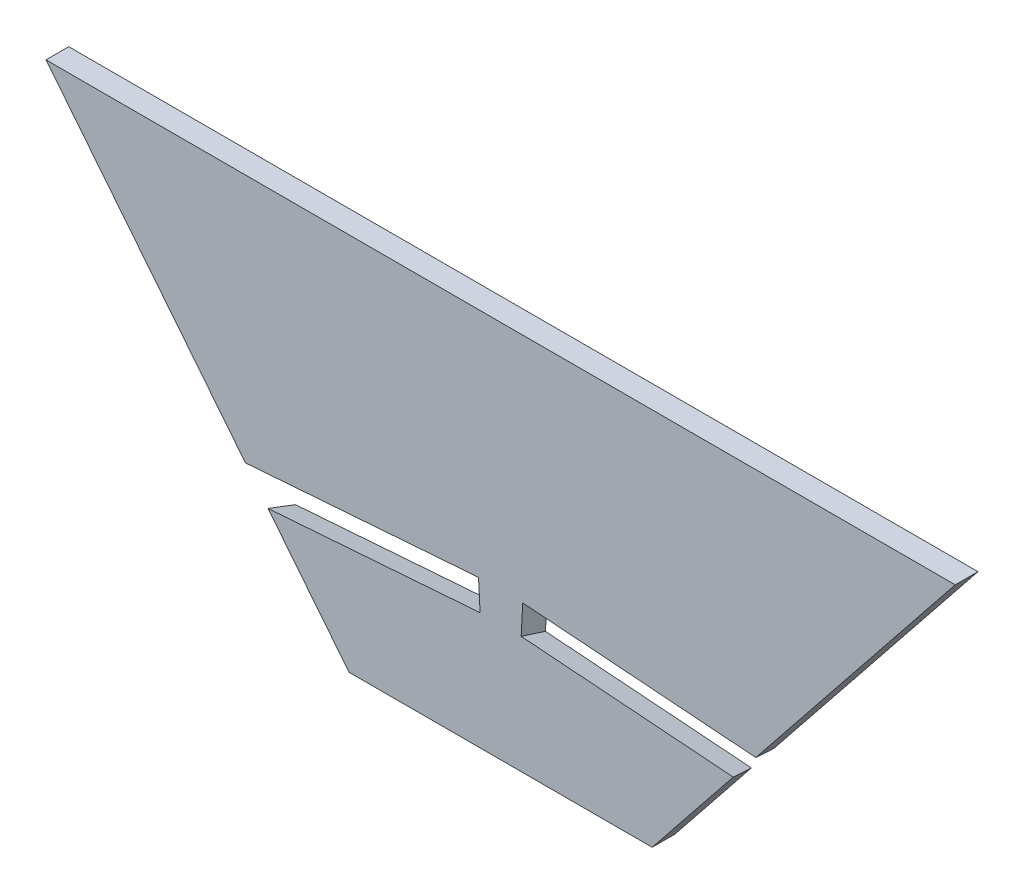
ISO-10303-21;
HEADER;
FILE_DESCRIPTION(('STEP AP214'),'2;1');
FILE_NAME('part.step','',(''),(''),'','','');
FILE_SCHEMA(('AUTOMOTIVE_DESIGN { 1 0 10303 214 1 1 1 1 }'));
ENDSEC;
DATA;
#1=APPLICATION_CONTEXT('core data for automotive mechanical design processes');
#2=APPLICATION_PROTOCOL_DEFINITION('international standard','automotive_design',2000,#1);
#3=PRODUCT_CONTEXT('',#1,'mechanical');
#4=PRODUCT('Part','Part','',(#3));
#5=PRODUCT_RELATED_PRODUCT_CATEGORY('part','',(#4));
#6=PRODUCT_DEFINITION_FORMATION('','',#4);
#7=PRODUCT_DEFINITION_CONTEXT('part definition',#1,'design');
#8=PRODUCT_DEFINITION('design','',#6,#7);
#9=PRODUCT_DEFINITION_SHAPE('','',#8);
#10=(LENGTH_UNIT() NAMED_UNIT(*) SI_UNIT(.MILLI.,.METRE.));
#11=(NAMED_UNIT(*) PLANE_ANGLE_UNIT() SI_UNIT($,.RADIAN.));
#12=(NAMED_UNIT(*) SI_UNIT($,.STERADIAN.) SOLID_ANGLE_UNIT());
#13=UNCERTAINTY_MEASURE_WITH_UNIT(LENGTH_MEASURE(1.E-05),#10,'distance_accuracy_value','');
#14=(GEOMETRIC_REPRESENTATION_CONTEXT(3) GLOBAL_UNCERTAINTY_ASSIGNED_CONTEXT((#13)) GLOBAL_UNIT_ASSIGNED_CONTEXT((#10,
#11,#12)) REPRESENTATION_CONTEXT('',''));
#15=CARTESIAN_POINT('',(0.,0.,0.));
#16=DIRECTION('',(0.,0.,1.));
#17=DIRECTION('',(1.,0.,0.));
#18=AXIS2_PLACEMENT_3D('',#15,#16,#17);
#19=CARTESIAN_POINT('',(-20.,-15.,-3.));
#20=DIRECTION('',(0.780868809443031,0.624695047554424,0.));
#21=DIRECTION('',(-0.624695047554424,0.780868809443031,0.));
#22=AXIS2_PLACEMENT_3D('',#19,#20,#21);
#23=PLANE('',#22);
#24=DIRECTION('',(-0.191721072768965,0.239651340961206,0.95174065008899));
#25=VECTOR('',#24,1.);
#26=CARTESIAN_POINT('',(-29.1440905305252,-3.56988683684344,-7.72014807025169));
#27=LINE('',#26,#25);
#28=CARTESIAN_POINT('',(-30.0949292401804,-2.38133844977445,-3.));
#29=VERTEX_POINT('',#28);
#30=CARTESIAN_POINT('',(-30.6992569194207,-1.62592885072412,0.));
#31=VERTEX_POINT('',#30);
#32=EDGE_CURVE('E156',#29,#31,#27,.T.);
#33=ORIENTED_EDGE('',*,*,#32,.F.);
#34=DIRECTION('',(-0.624695047554424,0.780868809443031,0.));
#35=VECTOR('',#34,1.);
#36=CARTESIAN_POINT('',(-20.,-15.,-3.));
#37=LINE('',#36,#35);
#38=CARTESIAN_POINT('',(-20.,-15.,-3.));
#39=VERTEX_POINT('',#38);
#40=EDGE_CURVE('E248',#39,#29,#37,.T.);
#41=ORIENTED_EDGE('',*,*,#40,.F.);
#42=DIRECTION('',(0.,0.,1.));
#43=VECTOR('',#42,1.);
#44=CARTESIAN_POINT('',(-20.,-15.,-3.));
#45=LINE('',#44,#43);
#46=CARTESIAN_POINT('',(-20.,-15.,0.));
#47=VERTEX_POINT('',#46);
#48=EDGE_CURVE('E130',#39,#47,#45,.T.);
#49=ORIENTED_EDGE('',*,*,#48,.T.);
#50=DIRECTION('',(-0.624695047554424,0.780868809443031,0.));
#51=VECTOR('',#50,1.);
#52=CARTESIAN_POINT('',(-20.,-15.,0.));
#53=LINE('',#52,#51);
#54=EDGE_CURVE('E233',#47,#31,#53,.T.);
#55=ORIENTED_EDGE('',*,*,#54,.T.);
#56=EDGE_LOOP('',(#33,#41,#49,#55));
#57=FACE_BOUND('',#56,.T.);
#58=ADVANCED_FACE('F46',(#57),#23,.F.);
#59=CARTESIAN_POINT('',(20.,-15.,-3.));
#60=DIRECTION('',(0.78086880944303,-0.624695047554424,0.));
#61=DIRECTION('',(0.624695047554424,0.78086880944303,0.));
#62=AXIS2_PLACEMENT_3D('',#59,#60,#61);
#63=PLANE('',#62);
#64=DIRECTION('',(0.624695047554424,0.780868809443031,0.));
#65=VECTOR('',#64,1.);
#66=CARTESIAN_POINT('',(20.,-15.,-3.));
#67=LINE('',#66,#65);
#68=CARTESIAN_POINT('',(20.,-15.,-3.));
#69=VERTEX_POINT('',#68);
#70=CARTESIAN_POINT('',(30.0949292401815,-2.38133844977318,-3.));
#71=VERTEX_POINT('',#70);
#72=EDGE_CURVE('E110',#69,#71,#67,.T.);
#73=ORIENTED_EDGE('',*,*,#72,.T.);
#74=DIRECTION('',(0.191721072768964,0.239651340961205,0.95174065008899));
#75=VECTOR('',#74,1.);
#76=CARTESIAN_POINT('',(29.1440905305262,-3.56988683684228,-7.72014807025215));
#77=LINE('',#76,#75);
#78=CARTESIAN_POINT('',(30.6992569194217,-1.62592885072286,0.));
#79=VERTEX_POINT('',#78);
#80=EDGE_CURVE('E50',#71,#79,#77,.T.);
#81=ORIENTED_EDGE('',*,*,#80,.T.);
#82=DIRECTION('',(0.624695047554424,0.780868809443031,0.));
#83=VECTOR('',#82,1.);
#84=CARTESIAN_POINT('',(20.,-15.,0.));
#85=LINE('',#84,#83);
#86=CARTESIAN_POINT('',(20.,-15.,0.));
#87=VERTEX_POINT('',#86);
#88=EDGE_CURVE('E107',#87,#79,#85,.T.);
#89=ORIENTED_EDGE('',*,*,#88,.F.);
#90=DIRECTION('',(0.,0.,1.));
#91=VECTOR('',#90,1.);
#92=CARTESIAN_POINT('',(20.,-15.,-3.));
#93=LINE('',#92,#91);
#94=EDGE_CURVE('E134',#69,#87,#93,.T.);
#95=ORIENTED_EDGE('',*,*,#94,.F.);
#96=EDGE_LOOP('',(#73,#81,#89,#95));
#97=FACE_BOUND('',#96,.T.);
#98=ADVANCED_FACE('F104',(#97),#63,.T.);
#99=CARTESIAN_POINT('',(-33.0719629139812,1.33995364247656,-3.));
#100=VERTEX_POINT('',#99);
#101=CARTESIAN_POINT('',(-60.,35.,-3.));
#102=VERTEX_POINT('',#101);
#103=EDGE_CURVE('E123',#100,#102,#37,.T.);
#104=ORIENTED_EDGE('',*,*,#103,.F.);
#105=DIRECTION('',(-0.191721072768965,0.239651340961206,0.95174065008899));
#106=VECTOR('',#105,1.);
#107=CARTESIAN_POINT('',(-31.8407181915994,-0.199102260500768,-9.11213799074904));
#108=LINE('',#107,#106);
#109=CARTESIAN_POINT('',(-33.6762905932215,2.09536324152689,0.));
#110=VERTEX_POINT('',#109);
#111=EDGE_CURVE('E164',#100,#110,#108,.T.);
#112=ORIENTED_EDGE('',*,*,#111,.T.);
#113=CARTESIAN_POINT('',(-60.,35.,0.));
#114=VERTEX_POINT('',#113);
#115=EDGE_CURVE('E201',#110,#114,#53,.T.);
#116=ORIENTED_EDGE('',*,*,#115,.T.);
#117=DIRECTION('',(0.,0.,1.));
#118=VECTOR('',#117,1.);
#119=CARTESIAN_POINT('',(-60.,35.,-3.));
#120=LINE('',#119,#118);
#121=EDGE_CURVE('E143',#102,#114,#120,.T.);
#122=ORIENTED_EDGE('',*,*,#121,.F.);
#123=EDGE_LOOP('',(#104,#112,#116,#122));
#124=FACE_BOUND('',#123,.T.);
#125=ADVANCED_FACE('F262',(#124),#23,.F.);
#126=CARTESIAN_POINT('',(60.,35.,-3.));
#127=DIRECTION('',(0.,1.,0.));
#128=DIRECTION('',(-1.,0.,0.));
#129=AXIS2_PLACEMENT_3D('',#126,#127,#128);
#130=PLANE('',#129);
#131=DIRECTION('',(-1.,0.,0.));
#132=VECTOR('',#131,1.);
#133=CARTESIAN_POINT('',(60.,35.,0.));
#134=LINE('',#133,#132);
#135=CARTESIAN_POINT('',(60.,35.,0.));
#136=VERTEX_POINT('',#135);
#137=EDGE_CURVE('E126',#136,#114,#134,.T.);
#138=ORIENTED_EDGE('',*,*,#137,.F.);
#139=DIRECTION('',(0.,0.,1.));
#140=VECTOR('',#139,1.);
#141=CARTESIAN_POINT('',(60.,35.,-3.));
#142=LINE('',#141,#140);
#143=CARTESIAN_POINT('',(60.,35.,-3.));
#144=VERTEX_POINT('',#143);
#145=EDGE_CURVE('E139',#144,#136,#142,.T.);
#146=ORIENTED_EDGE('',*,*,#145,.F.);
#147=DIRECTION('',(-1.,0.,0.));
#148=VECTOR('',#147,1.);
#149=CARTESIAN_POINT('',(60.,35.,-3.));
#150=LINE('',#149,#148);
#151=EDGE_CURVE('E245',#144,#102,#150,.T.);
#152=ORIENTED_EDGE('',*,*,#151,.T.);
#153=ORIENTED_EDGE('',*,*,#121,.T.);
#154=EDGE_LOOP('',(#138,#146,#152,#153));
#155=FACE_BOUND('',#154,.T.);
#156=ADVANCED_FACE('F229',(#155),#130,.T.);
#157=DIRECTION('',(0.191721072768964,0.239651340961205,0.95174065008899));
#158=VECTOR('',#157,1.);
#159=CARTESIAN_POINT('',(31.8407181916003,-0.199102260499611,-9.11213799074949));
#160=LINE('',#159,#158);
#161=CARTESIAN_POINT('',(33.0719629139823,1.33995364247782,-3.));
#162=VERTEX_POINT('',#161);
#163=CARTESIAN_POINT('',(33.6762905932225,2.09536324152814,0.));
#164=VERTEX_POINT('',#163);
#165=EDGE_CURVE('E192',#162,#164,#160,.T.);
#166=ORIENTED_EDGE('',*,*,#165,.F.);
#167=EDGE_CURVE('E224',#162,#144,#67,.T.);
#168=ORIENTED_EDGE('',*,*,#167,.T.);
#169=ORIENTED_EDGE('',*,*,#145,.T.);
#170=EDGE_CURVE('E119',#164,#136,#85,.T.);
#171=ORIENTED_EDGE('',*,*,#170,.F.);
#172=EDGE_LOOP('',(#166,#168,#169,#171));
#173=FACE_BOUND('',#172,.T.);
#174=ADVANCED_FACE('F218',(#173),#63,.T.);
#175=CARTESIAN_POINT('',(-20.,-15.,-3.));
#176=DIRECTION('',(0.,-1.,0.));
#177=DIRECTION('',(1.,0.,0.));
#178=AXIS2_PLACEMENT_3D('',#175,#176,#177);
#179=PLANE('',#178);
#180=DIRECTION('',(1.,0.,0.));
#181=VECTOR('',#180,1.);
#182=CARTESIAN_POINT('',(-20.,-15.,0.));
#183=LINE('',#182,#181);
#184=EDGE_CURVE('E117',#47,#87,#183,.T.);
#185=ORIENTED_EDGE('',*,*,#184,.F.);
#186=ORIENTED_EDGE('',*,*,#48,.F.);
#187=DIRECTION('',(1.,0.,0.));
#188=VECTOR('',#187,1.);
#189=CARTESIAN_POINT('',(-20.,-15.,-3.));
#190=LINE('',#189,#188);
#191=EDGE_CURVE('E135',#39,#69,#190,.T.);
#192=ORIENTED_EDGE('',*,*,#191,.T.);
#193=ORIENTED_EDGE('',*,*,#94,.T.);
#194=EDGE_LOOP('',(#185,#186,#192,#193));
#195=FACE_BOUND('',#194,.T.);
#196=ADVANCED_FACE('F292',(#195),#179,.T.);
#197=CARTESIAN_POINT('',(0.,0.,-3.));
#198=DIRECTION('',(0.,0.,-1.));
#199=DIRECTION('',(-1.,0.,0.));
#200=AXIS2_PLACEMENT_3D('',#197,#198,#199);
#201=PLANE('',#200);
#202=DIRECTION('',(0.997235586071988,-0.0743046827034435,0.));
#203=VECTOR('',#202,1.);
#204=CARTESIAN_POINT('',(0.281886046226901,3.78316394454601,-3.));
#205=LINE('',#204,#203);
#206=CARTESIAN_POINT('',(3.12054545538294,3.57165355558035,-3.));
#207=VERTEX_POINT('',#206);
#208=EDGE_CURVE('E195',#207,#162,#205,.T.);
#209=ORIENTED_EDGE('',*,*,#208,.F.);
#210=DIRECTION('',(-0.0525118926186378,-0.998620298779075,0.));
#211=VECTOR('',#210,1.);
#212=CARTESIAN_POINT('',(2.92464503572571,-0.153790831461595,-3.));
#213=LINE('',#212,#211);
#214=CARTESIAN_POINT('',(2.9140082949048,-0.356070063211235,-3.));
#215=VERTEX_POINT('',#214);
#216=EDGE_CURVE('E198',#207,#215,#213,.T.);
#217=ORIENTED_EDGE('',*,*,#216,.T.);
#218=DIRECTION('',(0.997235586071988,-0.0743046827034435,0.));
#219=VECTOR('',#218,1.);
#220=CARTESIAN_POINT('',(-0.0102957516794498,-0.138178235698623,-3.));
#221=LINE('',#220,#219);
#222=EDGE_CURVE('E112',#215,#71,#221,.T.);
#223=ORIENTED_EDGE('',*,*,#222,.T.);
#224=ORIENTED_EDGE('',*,*,#72,.F.);
#225=ORIENTED_EDGE('',*,*,#191,.F.);
#226=ORIENTED_EDGE('',*,*,#40,.T.);
#227=DIRECTION('',(0.997235586071988,0.0743046827034382,0.));
#228=VECTOR('',#227,1.);
#229=CARTESIAN_POINT('',(0.010295751679561,-0.138178235700125,-3.));
#230=LINE('',#229,#228);
#231=CARTESIAN_POINT('',(-2.91400829489449,-0.356070063211962,-3.));
#232=VERTEX_POINT('',#231);
#233=EDGE_CURVE('E159',#29,#232,#230,.T.);
#234=ORIENTED_EDGE('',*,*,#233,.T.);
#235=DIRECTION('',(0.0525118926186311,-0.998620298779075,0.));
#236=VECTOR('',#235,1.);
#237=CARTESIAN_POINT('',(-2.92464503571547,-0.153790831461037,-3.));
#238=LINE('',#237,#236);
#239=CARTESIAN_POINT('',(-3.12054545537261,3.57165355557963,-3.));
#240=VERTEX_POINT('',#239);
#241=EDGE_CURVE('E113',#240,#232,#238,.T.);
#242=ORIENTED_EDGE('',*,*,#241,.F.);
#243=DIRECTION('',(0.997235586071988,0.0743046827034382,0.));
#244=VECTOR('',#243,1.);
#245=CARTESIAN_POINT('',(-0.281886046226769,3.78316394454451,-3.));
#246=LINE('',#245,#244);
#247=EDGE_CURVE('E168',#100,#240,#246,.T.);
#248=ORIENTED_EDGE('',*,*,#247,.F.);
#249=ORIENTED_EDGE('',*,*,#103,.T.);
#250=ORIENTED_EDGE('',*,*,#151,.F.);
#251=ORIENTED_EDGE('',*,*,#167,.F.);
#252=EDGE_LOOP('',(#209,#217,#223,#224,#225,#226,#234,#242,#248,#249,#250,#251));
#253=FACE_BOUND('',#252,.T.);
#254=ADVANCED_FACE('F205',(#253),#201,.T.);
#255=CARTESIAN_POINT('',(0.,0.,0.));
#256=DIRECTION('',(0.,0.,-1.));
#257=DIRECTION('',(-1.,0.,0.));
#258=AXIS2_PLACEMENT_3D('',#255,#256,#257);
#259=PLANE('',#258);
#260=DIRECTION('',(-0.0525118926186378,-0.998620298779075,0.));
#261=VECTOR('',#260,1.);
#262=CARTESIAN_POINT('',(2.67879002523954,-0.140862682568379,0.));
#263=LINE('',#262,#261);
#264=CARTESIAN_POINT('',(2.91689914293902,4.38726583083199,0.));
#265=VERTEX_POINT('',#264);
#266=CARTESIAN_POINT('',(2.71036198246087,0.459542212040406,0.));
#267=VERTEX_POINT('',#266);
#268=EDGE_CURVE('E57',#265,#267,#263,.T.);
#269=ORIENTED_EDGE('',*,*,#268,.F.);
#270=DIRECTION('',(0.997235586071988,-0.0743046827034435,0.));
#271=VECTOR('',#270,1.);
#272=CARTESIAN_POINT('',(0.341197954385319,4.57918302896189,0.));
#273=LINE('',#272,#271);
#274=EDGE_CURVE('E12',#265,#164,#273,.T.);
#275=ORIENTED_EDGE('',*,*,#274,.T.);
#276=ORIENTED_EDGE('',*,*,#170,.T.);
#277=ORIENTED_EDGE('',*,*,#137,.T.);
#278=ORIENTED_EDGE('',*,*,#115,.F.);
#279=DIRECTION('',(0.997235586071988,0.0743046827034382,0.));
#280=VECTOR('',#279,1.);
#281=CARTESIAN_POINT('',(-0.341197954385183,4.57918302896039,0.));
#282=LINE('',#281,#280);
#283=CARTESIAN_POINT('',(-2.91689914292866,4.38726583083127,0.));
#284=VERTEX_POINT('',#283);
#285=EDGE_CURVE('E99',#110,#284,#282,.T.);
#286=ORIENTED_EDGE('',*,*,#285,.T.);
#287=DIRECTION('',(0.0525118926186311,-0.998620298779075,0.));
#288=VECTOR('',#287,1.);
#289=CARTESIAN_POINT('',(-2.67879002522928,-0.140862682567822,0.));
#290=LINE('',#289,#288);
#291=CARTESIAN_POINT('',(-2.71036198245054,0.459542212039677,0.));
#292=VERTEX_POINT('',#291);
#293=EDGE_CURVE('E178',#284,#292,#290,.T.);
#294=ORIENTED_EDGE('',*,*,#293,.T.);
#295=DIRECTION('',(0.997235586071988,0.0743046827034382,0.));
#296=VECTOR('',#295,1.);
#297=CARTESIAN_POINT('',(-0.0490161564788527,0.657840848715759,0.));
#298=LINE('',#297,#296);
#299=EDGE_CURVE('E147',#31,#292,#298,.T.);
#300=ORIENTED_EDGE('',*,*,#299,.F.);
#301=ORIENTED_EDGE('',*,*,#54,.F.);
#302=ORIENTED_EDGE('',*,*,#184,.T.);
#303=ORIENTED_EDGE('',*,*,#88,.T.);
#304=DIRECTION('',(0.997235586071988,-0.0743046827034435,0.));
#305=VECTOR('',#304,1.);
#306=CARTESIAN_POINT('',(0.0490161564789681,0.65784084871726,0.));
#307=LINE('',#306,#305);
#308=EDGE_CURVE('E93',#267,#79,#307,.T.);
#309=ORIENTED_EDGE('',*,*,#308,.F.);
#310=EDGE_LOOP('',(#269,#275,#276,#277,#278,#286,#294,#300,#301,#302,#303,#309));
#311=FACE_BOUND('',#310,.T.);
#312=ADVANCED_FACE('F114',(#311),#259,.F.);
#313=CARTESIAN_POINT('',(-3.29502482110993,2.37233891240944,-5.89060160899108));
#314=DIRECTION('',(0.995274511238513,0.052335956242944,-0.0817899441439845));
#315=DIRECTION('',(0.0718063427038973,-0.963705619143889,0.257129011933669));
#316=AXIS2_PLACEMENT_3D('',#313,#314,#315);
#317=PLANE('',#316);
#318=ORIENTED_EDGE('',*,*,#241,.T.);
#319=DIRECTION('',(0.0653643360436707,0.26178698843646,0.962909692680959));
#320=VECTOR('',#319,1.);
#321=CARTESIAN_POINT('',(-3.05088325591668,-0.904260192679771,-5.01636296841661));
#322=LINE('',#321,#320);
#323=EDGE_CURVE('E148',#232,#292,#322,.T.);
#324=ORIENTED_EDGE('',*,*,#323,.T.);
#325=ORIENTED_EDGE('',*,*,#293,.F.);
#326=DIRECTION('',(0.0653643360436707,0.26178698843646,0.962909692680959));
#327=VECTOR('',#326,1.);
#328=CARTESIAN_POINT('',(-3.32374735819149,2.75782116006701,-5.99345321376455));
#329=LINE('',#328,#327);
#330=EDGE_CURVE('E152',#240,#284,#329,.T.);
#331=ORIENTED_EDGE('',*,*,#330,.F.);
#332=EDGE_LOOP('',(#318,#324,#325,#331));
#333=FACE_BOUND('',#332,.T.);
#334=ADVANCED_FACE('F287',(#333),#317,.F.);
#335=CARTESIAN_POINT('',(-302.304210534241,-12.9639000953134,18.5762460070884));
#336=DIRECTION('',(-0.0718063427038973,0.963705619143889,-0.257129011933669));
#337=DIRECTION('',(0.995274511238513,0.052335956242944,-0.0817899441439845));
#338=AXIS2_PLACEMENT_3D('',#335,#336,#337);
#339=PLANE('',#338);
#340=ORIENTED_EDGE('',*,*,#247,.T.);
#341=ORIENTED_EDGE('',*,*,#330,.T.);
#342=ORIENTED_EDGE('',*,*,#285,.F.);
#343=ORIENTED_EDGE('',*,*,#111,.F.);
#344=EDGE_LOOP('',(#340,#341,#342,#343));
#345=FACE_BOUND('',#344,.T.);
#346=ADVANCED_FACE('F286',(#345),#339,.F.);
#347=CARTESIAN_POINT('',(-302.031346431966,-16.6259814480602,19.5533362524363));
#348=DIRECTION('',(-0.0718063427038973,0.963705619143889,-0.257129011933669));
#349=DIRECTION('',(0.995274511238513,0.052335956242944,-0.0817899441439845));
#350=AXIS2_PLACEMENT_3D('',#347,#348,#349);
#351=PLANE('',#350);
#352=ORIENTED_EDGE('',*,*,#32,.T.);
#353=ORIENTED_EDGE('',*,*,#299,.T.);
#354=ORIENTED_EDGE('',*,*,#323,.F.);
#355=ORIENTED_EDGE('',*,*,#233,.F.);
#356=EDGE_LOOP('',(#352,#353,#354,#355));
#357=FACE_BOUND('',#356,.T.);
#358=ADVANCED_FACE('F288',(#357),#351,.T.);
#359=CARTESIAN_POINT('',(3.29502482112009,2.3723389124108,-5.89060160898878));
#360=DIRECTION('',(0.995274511238513,-0.0523359562429507,0.0817899441439797));
#361=DIRECTION('',(-0.0718063427039025,-0.963705619143888,0.257129011933668));
#362=AXIS2_PLACEMENT_3D('',#359,#360,#361);
#363=PLANE('',#362);
#364=DIRECTION('',(-0.0653643360436644,0.261786988436459,0.96290969268096));
#365=VECTOR('',#364,1.);
#366=CARTESIAN_POINT('',(3.32374735820165,2.75782116006836,-5.99345321376225));
#367=LINE('',#366,#365);
#368=EDGE_CURVE('E160',#207,#265,#367,.T.);
#369=ORIENTED_EDGE('',*,*,#368,.T.);
#370=ORIENTED_EDGE('',*,*,#268,.T.);
#371=DIRECTION('',(-0.0653643360436644,0.261786988436459,0.96290969268096));
#372=VECTOR('',#371,1.);
#373=CARTESIAN_POINT('',(3.05088325592682,-0.904260192678421,-5.01636296841431));
#374=LINE('',#373,#372);
#375=EDGE_CURVE('E66',#215,#267,#374,.T.);
#376=ORIENTED_EDGE('',*,*,#375,.F.);
#377=ORIENTED_EDGE('',*,*,#216,.F.);
#378=EDGE_LOOP('',(#369,#370,#376,#377));
#379=FACE_BOUND('',#378,.T.);
#380=ADVANCED_FACE('F210',(#379),#363,.T.);
#381=CARTESIAN_POINT('',(302.304210534251,-12.963900095314,18.5762460070893));
#382=DIRECTION('',(0.0718063427039025,0.963705619143888,-0.257129011933668));
#383=DIRECTION('',(0.995274511238513,-0.0523359562429507,0.0817899441439797));
#384=AXIS2_PLACEMENT_3D('',#381,#382,#383);
#385=PLANE('',#384);
#386=ORIENTED_EDGE('',*,*,#208,.T.);
#387=ORIENTED_EDGE('',*,*,#165,.T.);
#388=ORIENTED_EDGE('',*,*,#274,.F.);
#389=ORIENTED_EDGE('',*,*,#368,.F.);
#390=EDGE_LOOP('',(#386,#387,#388,#389));
#391=FACE_BOUND('',#390,.T.);
#392=ADVANCED_FACE('F48',(#391),#385,.F.);
#393=CARTESIAN_POINT('',(302.031346431976,-16.6259814480608,19.5533362524372));
#394=DIRECTION('',(0.0718063427039025,0.963705619143888,-0.257129011933668));
#395=DIRECTION('',(0.995274511238513,-0.0523359562429507,0.0817899441439797));
#396=AXIS2_PLACEMENT_3D('',#393,#394,#395);
#397=PLANE('',#396);
#398=ORIENTED_EDGE('',*,*,#375,.T.);
#399=ORIENTED_EDGE('',*,*,#308,.T.);
#400=ORIENTED_EDGE('',*,*,#80,.F.);
#401=ORIENTED_EDGE('',*,*,#222,.F.);
#402=EDGE_LOOP('',(#398,#399,#400,#401));
#403=FACE_BOUND('',#402,.T.);
#404=ADVANCED_FACE('F94',(#403),#397,.T.);
#405=CLOSED_SHELL('',(#58,#98,#125,#156,#174,#196,#254,#312,#334,#346,#358,#380,#392,#404));
#406=MANIFOLD_SOLID_BREP('B2',#405);
#407=ADVANCED_BREP_SHAPE_REPRESENTATION('',(#18,#406),#14);
#408=SHAPE_DEFINITION_REPRESENTATION(#9,#407);
ENDSEC;
END-ISO-10303-21;
